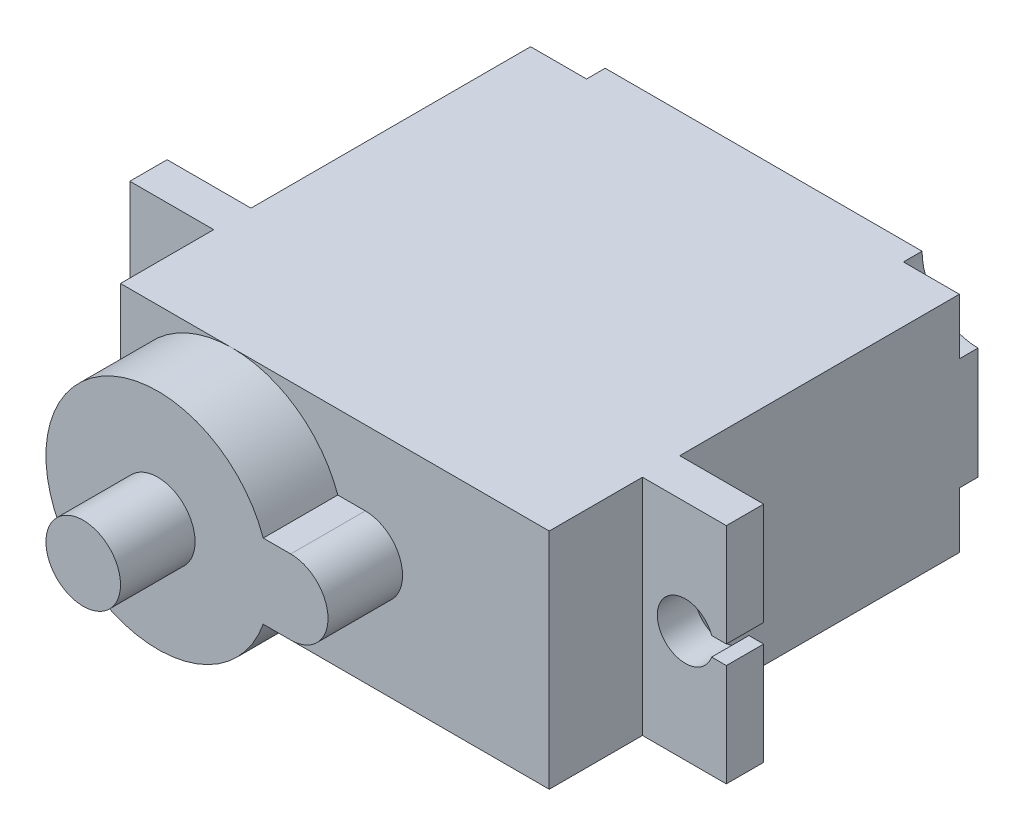
ISO-10303-21;
HEADER;
FILE_DESCRIPTION(('STEP AP214'),'2;1');
FILE_NAME('part.step','',(''),(''),'','','');
FILE_SCHEMA(('AUTOMOTIVE_DESIGN { 1 0 10303 214 1 1 1 1 }'));
ENDSEC;
DATA;
#1=APPLICATION_CONTEXT('core data for automotive mechanical design processes');
#2=APPLICATION_PROTOCOL_DEFINITION('international standard','automotive_design',2000,#1);
#3=PRODUCT_CONTEXT('',#1,'mechanical');
#4=PRODUCT('Part','Part','',(#3));
#5=PRODUCT_RELATED_PRODUCT_CATEGORY('part','',(#4));
#6=PRODUCT_DEFINITION_FORMATION('','',#4);
#7=PRODUCT_DEFINITION_CONTEXT('part definition',#1,'design');
#8=PRODUCT_DEFINITION('design','',#6,#7);
#9=PRODUCT_DEFINITION_SHAPE('','',#8);
#10=(LENGTH_UNIT() NAMED_UNIT(*) SI_UNIT(.MILLI.,.METRE.));
#11=(NAMED_UNIT(*) PLANE_ANGLE_UNIT() SI_UNIT($,.RADIAN.));
#12=(NAMED_UNIT(*) SI_UNIT($,.STERADIAN.) SOLID_ANGLE_UNIT());
#13=UNCERTAINTY_MEASURE_WITH_UNIT(LENGTH_MEASURE(1.E-05),#10,'distance_accuracy_value','');
#14=(GEOMETRIC_REPRESENTATION_CONTEXT(3) GLOBAL_UNCERTAINTY_ASSIGNED_CONTEXT((#13)) GLOBAL_UNIT_ASSIGNED_CONTEXT((#10,
#11,#12)) REPRESENTATION_CONTEXT('',''));
#15=CARTESIAN_POINT('',(0.,0.,0.));
#16=DIRECTION('',(0.,0.,1.));
#17=DIRECTION('',(1.,0.,0.));
#18=AXIS2_PLACEMENT_3D('',#15,#16,#17);
#19=CARTESIAN_POINT('',(-11.5,6.,16.));
#20=DIRECTION('',(1.,0.,0.));
#21=DIRECTION('',(0.,0.,-1.));
#22=AXIS2_PLACEMENT_3D('',#19,#20,#21);
#23=PLANE('',#22);
#24=DIRECTION('',(0.,0.,-1.));
#25=VECTOR('',#24,1.);
#26=CARTESIAN_POINT('',(-11.5,-3.,1.));
#27=LINE('',#26,#25);
#28=CARTESIAN_POINT('',(-11.5,-3.,1.));
#29=VERTEX_POINT('',#28);
#30=CARTESIAN_POINT('',(-11.5,-3.,0.));
#31=VERTEX_POINT('',#30);
#32=EDGE_CURVE('E50',#29,#31,#27,.T.);
#33=ORIENTED_EDGE('',*,*,#32,.F.);
#34=DIRECTION('',(0.,1.,0.));
#35=VECTOR('',#34,1.);
#36=CARTESIAN_POINT('',(-11.5,6.,1.));
#37=LINE('',#36,#35);
#38=CARTESIAN_POINT('',(-11.5,-6.,1.));
#39=VERTEX_POINT('',#38);
#40=EDGE_CURVE('E262',#39,#29,#37,.T.);
#41=ORIENTED_EDGE('',*,*,#40,.F.);
#42=DIRECTION('',(0.,0.,-1.));
#43=VECTOR('',#42,1.);
#44=CARTESIAN_POINT('',(-11.5,-6.,16.));
#45=LINE('',#44,#43);
#46=CARTESIAN_POINT('',(-11.5,-6.,16.));
#47=VERTEX_POINT('',#46);
#48=EDGE_CURVE('E267',#47,#39,#45,.T.);
#49=ORIENTED_EDGE('',*,*,#48,.F.);
#50=DIRECTION('',(0.,-1.,0.));
#51=VECTOR('',#50,1.);
#52=CARTESIAN_POINT('',(-11.5,6.,16.));
#53=LINE('',#52,#51);
#54=CARTESIAN_POINT('',(-11.5,6.,16.));
#55=VERTEX_POINT('',#54);
#56=EDGE_CURVE('E281',#55,#47,#53,.T.);
#57=ORIENTED_EDGE('',*,*,#56,.F.);
#58=DIRECTION('',(0.,0.,-1.));
#59=VECTOR('',#58,1.);
#60=CARTESIAN_POINT('',(-11.5,6.,16.));
#61=LINE('',#60,#59);
#62=CARTESIAN_POINT('',(-11.5,6.,1.));
#63=VERTEX_POINT('',#62);
#64=EDGE_CURVE('E274',#55,#63,#61,.T.);
#65=ORIENTED_EDGE('',*,*,#64,.T.);
#66=DIRECTION('',(0.,1.,0.));
#67=VECTOR('',#66,1.);
#68=CARTESIAN_POINT('',(-11.5,6.,1.));
#69=LINE('',#68,#67);
#70=CARTESIAN_POINT('',(-11.5,3.,1.));
#71=VERTEX_POINT('',#70);
#72=EDGE_CURVE('E534',#71,#63,#69,.T.);
#73=ORIENTED_EDGE('',*,*,#72,.F.);
#74=DIRECTION('',(0.,0.,-1.));
#75=VECTOR('',#74,1.);
#76=CARTESIAN_POINT('',(-11.5,3.,1.));
#77=LINE('',#76,#75);
#78=CARTESIAN_POINT('',(-11.5,3.,0.));
#79=VERTEX_POINT('',#78);
#80=EDGE_CURVE('E575',#71,#79,#77,.T.);
#81=ORIENTED_EDGE('',*,*,#80,.T.);
#82=DIRECTION('',(0.,-1.,0.));
#83=VECTOR('',#82,1.);
#84=CARTESIAN_POINT('',(-11.5,6.,0.));
#85=LINE('',#84,#83);
#86=EDGE_CURVE('E300',#79,#31,#85,.T.);
#87=ORIENTED_EDGE('',*,*,#86,.T.);
#88=EDGE_LOOP('',(#33,#41,#49,#57,#65,#73,#81,#87));
#89=FACE_BOUND('',#88,.T.);
#90=ADVANCED_FACE('F35',(#89),#23,.F.);
#91=CARTESIAN_POINT('',(-11.5,-6.,16.));
#92=DIRECTION('',(0.,1.,0.));
#93=DIRECTION('',(0.,0.,1.));
#94=AXIS2_PLACEMENT_3D('',#91,#92,#93);
#95=PLANE('',#94);
#96=DIRECTION('',(0.,0.,-1.));
#97=VECTOR('',#96,1.);
#98=CARTESIAN_POINT('',(-8.5,-6.,1.));
#99=LINE('',#98,#97);
#100=CARTESIAN_POINT('',(-8.5,-6.,0.));
#101=VERTEX_POINT('',#100);
#102=CARTESIAN_POINT('',(-8.5,-6.,1.));
#103=VERTEX_POINT('',#102);
#104=EDGE_CURVE('E252',#101,#103,#99,.F.);
#105=ORIENTED_EDGE('',*,*,#104,.F.);
#106=DIRECTION('',(1.,0.,0.));
#107=VECTOR('',#106,1.);
#108=CARTESIAN_POINT('',(-11.5,-6.,0.));
#109=LINE('',#108,#107);
#110=CARTESIAN_POINT('',(8.5,-6.,0.));
#111=VERTEX_POINT('',#110);
#112=EDGE_CURVE('E58',#101,#111,#109,.T.);
#113=ORIENTED_EDGE('',*,*,#112,.T.);
#114=DIRECTION('',(0.,0.,-1.));
#115=VECTOR('',#114,1.);
#116=CARTESIAN_POINT('',(8.5,-6.,1.));
#117=LINE('',#116,#115);
#118=CARTESIAN_POINT('',(8.5,-6.,1.));
#119=VERTEX_POINT('',#118);
#120=EDGE_CURVE('E547',#111,#119,#117,.F.);
#121=ORIENTED_EDGE('',*,*,#120,.T.);
#122=DIRECTION('',(-1.,0.,0.));
#123=VECTOR('',#122,1.);
#124=CARTESIAN_POINT('',(-11.5,-6.,1.));
#125=LINE('',#124,#123);
#126=CARTESIAN_POINT('',(11.5,-6.,1.));
#127=VERTEX_POINT('',#126);
#128=EDGE_CURVE('E43',#127,#119,#125,.T.);
#129=ORIENTED_EDGE('',*,*,#128,.F.);
#130=DIRECTION('',(0.,0.,-1.));
#131=VECTOR('',#130,1.);
#132=CARTESIAN_POINT('',(11.5,-6.,16.));
#133=LINE('',#132,#131);
#134=CARTESIAN_POINT('',(11.5,-6.,16.));
#135=VERTEX_POINT('',#134);
#136=EDGE_CURVE('E275',#135,#127,#133,.T.);
#137=ORIENTED_EDGE('',*,*,#136,.F.);
#138=DIRECTION('',(1.,0.,0.));
#139=VECTOR('',#138,1.);
#140=CARTESIAN_POINT('',(-16.,-6.,16.));
#141=LINE('',#140,#139);
#142=CARTESIAN_POINT('',(16.,-6.,16.));
#143=VERTEX_POINT('',#142);
#144=EDGE_CURVE('E411',#135,#143,#141,.T.);
#145=ORIENTED_EDGE('',*,*,#144,.T.);
#146=DIRECTION('',(0.,0.,-1.));
#147=VECTOR('',#146,1.);
#148=CARTESIAN_POINT('',(16.,-6.,18.));
#149=LINE('',#148,#147);
#150=CARTESIAN_POINT('',(16.,-6.,18.));
#151=VERTEX_POINT('',#150);
#152=EDGE_CURVE('E391',#151,#143,#149,.T.);
#153=ORIENTED_EDGE('',*,*,#152,.F.);
#154=DIRECTION('',(1.,0.,0.));
#155=VECTOR('',#154,1.);
#156=CARTESIAN_POINT('',(-16.,-6.,18.));
#157=LINE('',#156,#155);
#158=CARTESIAN_POINT('',(11.5,-6.,18.));
#159=VERTEX_POINT('',#158);
#160=EDGE_CURVE('E324',#159,#151,#157,.T.);
#161=ORIENTED_EDGE('',*,*,#160,.F.);
#162=DIRECTION('',(0.,0.,-1.));
#163=VECTOR('',#162,1.);
#164=CARTESIAN_POINT('',(11.5,-6.,23.));
#165=LINE('',#164,#163);
#166=CARTESIAN_POINT('',(11.5,-6.,23.));
#167=VERTEX_POINT('',#166);
#168=EDGE_CURVE('E510',#167,#159,#165,.T.);
#169=ORIENTED_EDGE('',*,*,#168,.F.);
#170=DIRECTION('',(1.,0.,0.));
#171=VECTOR('',#170,1.);
#172=CARTESIAN_POINT('',(-11.5,-6.,23.));
#173=LINE('',#172,#171);
#174=CARTESIAN_POINT('',(-5.5,-6.,23.));
#175=VERTEX_POINT('',#174);
#176=EDGE_CURVE('E497',#175,#167,#173,.T.);
#177=ORIENTED_EDGE('',*,*,#176,.F.);
#178=CARTESIAN_POINT('',(-11.5,-6.,23.));
#179=VERTEX_POINT('',#178);
#180=EDGE_CURVE('E498',#179,#175,#173,.T.);
#181=ORIENTED_EDGE('',*,*,#180,.F.);
#182=DIRECTION('',(0.,0.,-1.));
#183=VECTOR('',#182,1.);
#184=CARTESIAN_POINT('',(-11.5,-6.,23.));
#185=LINE('',#184,#183);
#186=CARTESIAN_POINT('',(-11.5,-6.,18.));
#187=VERTEX_POINT('',#186);
#188=EDGE_CURVE('E508',#179,#187,#185,.T.);
#189=ORIENTED_EDGE('',*,*,#188,.T.);
#190=CARTESIAN_POINT('',(-16.,-6.,18.));
#191=VERTEX_POINT('',#190);
#192=EDGE_CURVE('E320',#191,#187,#157,.T.);
#193=ORIENTED_EDGE('',*,*,#192,.F.);
#194=DIRECTION('',(0.,0.,-1.));
#195=VECTOR('',#194,1.);
#196=CARTESIAN_POINT('',(-16.,-6.,18.));
#197=LINE('',#196,#195);
#198=CARTESIAN_POINT('',(-16.,-6.,16.));
#199=VERTEX_POINT('',#198);
#200=EDGE_CURVE('E299',#191,#199,#197,.T.);
#201=ORIENTED_EDGE('',*,*,#200,.T.);
#202=EDGE_CURVE('E270',#199,#47,#141,.T.);
#203=ORIENTED_EDGE('',*,*,#202,.T.);
#204=ORIENTED_EDGE('',*,*,#48,.T.);
#205=DIRECTION('',(-1.,0.,0.));
#206=VECTOR('',#205,1.);
#207=CARTESIAN_POINT('',(-11.5,-6.,1.));
#208=LINE('',#207,#206);
#209=EDGE_CURVE('E11',#103,#39,#208,.T.);
#210=ORIENTED_EDGE('',*,*,#209,.F.);
#211=EDGE_LOOP('',(#105,#113,#121,#129,#137,#145,#153,#161,#169,#177,#181,#189,#193,#201,#203,
#204,#210));
#212=FACE_BOUND('',#211,.T.);
#213=ADVANCED_FACE('F265',(#212),#95,.F.);
#214=CARTESIAN_POINT('',(11.5,6.,16.));
#215=DIRECTION('',(-1.,0.,0.));
#216=DIRECTION('',(0.,0.,1.));
#217=AXIS2_PLACEMENT_3D('',#214,#215,#216);
#218=PLANE('',#217);
#219=DIRECTION('',(0.,-1.,0.));
#220=VECTOR('',#219,1.);
#221=CARTESIAN_POINT('',(11.5,6.,1.));
#222=LINE('',#221,#220);
#223=CARTESIAN_POINT('',(11.5,-3.,1.));
#224=VERTEX_POINT('',#223);
#225=EDGE_CURVE('E544',#224,#127,#222,.T.);
#226=ORIENTED_EDGE('',*,*,#225,.F.);
#227=DIRECTION('',(0.,0.,-1.));
#228=VECTOR('',#227,1.);
#229=CARTESIAN_POINT('',(11.5,-3.,1.));
#230=LINE('',#229,#228);
#231=CARTESIAN_POINT('',(11.5,-3.,0.));
#232=VERTEX_POINT('',#231);
#233=EDGE_CURVE('E550',#224,#232,#230,.T.);
#234=ORIENTED_EDGE('',*,*,#233,.T.);
#235=DIRECTION('',(0.,1.,0.));
#236=VECTOR('',#235,1.);
#237=CARTESIAN_POINT('',(11.5,6.,0.));
#238=LINE('',#237,#236);
#239=CARTESIAN_POINT('',(11.5,3.,0.));
#240=VERTEX_POINT('',#239);
#241=EDGE_CURVE('E296',#232,#240,#238,.T.);
#242=ORIENTED_EDGE('',*,*,#241,.T.);
#243=DIRECTION('',(0.,0.,-1.));
#244=VECTOR('',#243,1.);
#245=CARTESIAN_POINT('',(11.5,3.,1.));
#246=LINE('',#245,#244);
#247=CARTESIAN_POINT('',(11.5,3.,1.));
#248=VERTEX_POINT('',#247);
#249=EDGE_CURVE('E566',#248,#240,#246,.T.);
#250=ORIENTED_EDGE('',*,*,#249,.F.);
#251=DIRECTION('',(0.,-1.,0.));
#252=VECTOR('',#251,1.);
#253=CARTESIAN_POINT('',(11.5,6.,1.));
#254=LINE('',#253,#252);
#255=CARTESIAN_POINT('',(11.5,6.,1.));
#256=VERTEX_POINT('',#255);
#257=EDGE_CURVE('E569',#256,#248,#254,.T.);
#258=ORIENTED_EDGE('',*,*,#257,.F.);
#259=DIRECTION('',(0.,0.,-1.));
#260=VECTOR('',#259,1.);
#261=CARTESIAN_POINT('',(11.5,6.,16.));
#262=LINE('',#261,#260);
#263=CARTESIAN_POINT('',(11.5,6.,16.));
#264=VERTEX_POINT('',#263);
#265=EDGE_CURVE('E278',#264,#256,#262,.T.);
#266=ORIENTED_EDGE('',*,*,#265,.F.);
#267=DIRECTION('',(0.,1.,0.));
#268=VECTOR('',#267,1.);
#269=CARTESIAN_POINT('',(11.5,6.,16.));
#270=LINE('',#269,#268);
#271=EDGE_CURVE('E289',#135,#264,#270,.T.);
#272=ORIENTED_EDGE('',*,*,#271,.F.);
#273=ORIENTED_EDGE('',*,*,#136,.T.);
#274=EDGE_LOOP('',(#226,#234,#242,#250,#258,#266,#272,#273));
#275=FACE_BOUND('',#274,.T.);
#276=ADVANCED_FACE('F37',(#275),#218,.F.);
#277=CARTESIAN_POINT('',(-11.5,6.,16.));
#278=DIRECTION('',(0.,-1.,0.));
#279=DIRECTION('',(0.,0.,-1.));
#280=AXIS2_PLACEMENT_3D('',#277,#278,#279);
#281=PLANE('',#280);
#282=DIRECTION('',(0.,0.,-1.));
#283=VECTOR('',#282,1.);
#284=CARTESIAN_POINT('',(8.5,6.,1.));
#285=LINE('',#284,#283);
#286=CARTESIAN_POINT('',(8.5,6.,0.));
#287=VERTEX_POINT('',#286);
#288=CARTESIAN_POINT('',(8.5,6.,1.));
#289=VERTEX_POINT('',#288);
#290=EDGE_CURVE('E562',#287,#289,#285,.F.);
#291=ORIENTED_EDGE('',*,*,#290,.F.);
#292=DIRECTION('',(-1.,0.,0.));
#293=VECTOR('',#292,1.);
#294=CARTESIAN_POINT('',(-11.5,6.,0.));
#295=LINE('',#294,#293);
#296=CARTESIAN_POINT('',(-8.5,6.,0.));
#297=VERTEX_POINT('',#296);
#298=EDGE_CURVE('E298',#287,#297,#295,.T.);
#299=ORIENTED_EDGE('',*,*,#298,.T.);
#300=DIRECTION('',(0.,0.,-1.));
#301=VECTOR('',#300,1.);
#302=CARTESIAN_POINT('',(-8.5,6.,1.));
#303=LINE('',#302,#301);
#304=CARTESIAN_POINT('',(-8.5,6.,1.));
#305=VERTEX_POINT('',#304);
#306=EDGE_CURVE('E578',#297,#305,#303,.F.);
#307=ORIENTED_EDGE('',*,*,#306,.T.);
#308=DIRECTION('',(1.,0.,0.));
#309=VECTOR('',#308,1.);
#310=CARTESIAN_POINT('',(-11.5,6.,1.));
#311=LINE('',#310,#309);
#312=EDGE_CURVE('E581',#63,#305,#311,.T.);
#313=ORIENTED_EDGE('',*,*,#312,.F.);
#314=ORIENTED_EDGE('',*,*,#64,.F.);
#315=DIRECTION('',(-1.,0.,0.));
#316=VECTOR('',#315,1.);
#317=CARTESIAN_POINT('',(-16.,6.,16.));
#318=LINE('',#317,#316);
#319=CARTESIAN_POINT('',(-16.,6.,16.));
#320=VERTEX_POINT('',#319);
#321=EDGE_CURVE('E367',#55,#320,#318,.T.);
#322=ORIENTED_EDGE('',*,*,#321,.T.);
#323=DIRECTION('',(0.,0.,-1.));
#324=VECTOR('',#323,1.);
#325=CARTESIAN_POINT('',(-16.,6.,18.));
#326=LINE('',#325,#324);
#327=CARTESIAN_POINT('',(-16.,6.,18.));
#328=VERTEX_POINT('',#327);
#329=EDGE_CURVE('E344',#328,#320,#326,.T.);
#330=ORIENTED_EDGE('',*,*,#329,.F.);
#331=DIRECTION('',(-1.,0.,0.));
#332=VECTOR('',#331,1.);
#333=CARTESIAN_POINT('',(-16.,6.,18.));
#334=LINE('',#333,#332);
#335=CARTESIAN_POINT('',(-11.5,6.,18.));
#336=VERTEX_POINT('',#335);
#337=EDGE_CURVE('E335',#336,#328,#334,.T.);
#338=ORIENTED_EDGE('',*,*,#337,.F.);
#339=DIRECTION('',(0.,0.,-1.));
#340=VECTOR('',#339,1.);
#341=CARTESIAN_POINT('',(-11.5,6.,23.));
#342=LINE('',#341,#340);
#343=CARTESIAN_POINT('',(-11.5,6.,23.));
#344=VERTEX_POINT('',#343);
#345=EDGE_CURVE('E408',#344,#336,#342,.T.);
#346=ORIENTED_EDGE('',*,*,#345,.F.);
#347=DIRECTION('',(-1.,0.,0.));
#348=VECTOR('',#347,1.);
#349=CARTESIAN_POINT('',(11.5,6.,23.));
#350=LINE('',#349,#348);
#351=CARTESIAN_POINT('',(-5.5,6.,23.));
#352=VERTEX_POINT('',#351);
#353=EDGE_CURVE('E493',#352,#344,#350,.T.);
#354=ORIENTED_EDGE('',*,*,#353,.F.);
#355=CARTESIAN_POINT('',(11.5,6.,23.));
#356=VERTEX_POINT('',#355);
#357=EDGE_CURVE('E489',#356,#352,#350,.T.);
#358=ORIENTED_EDGE('',*,*,#357,.F.);
#359=DIRECTION('',(0.,0.,-1.));
#360=VECTOR('',#359,1.);
#361=CARTESIAN_POINT('',(11.5,6.,23.));
#362=LINE('',#361,#360);
#363=CARTESIAN_POINT('',(11.5,6.,18.));
#364=VERTEX_POINT('',#363);
#365=EDGE_CURVE('E503',#356,#364,#362,.T.);
#366=ORIENTED_EDGE('',*,*,#365,.T.);
#367=CARTESIAN_POINT('',(16.,6.,18.));
#368=VERTEX_POINT('',#367);
#369=EDGE_CURVE('E343',#368,#364,#334,.T.);
#370=ORIENTED_EDGE('',*,*,#369,.F.);
#371=DIRECTION('',(0.,0.,-1.));
#372=VECTOR('',#371,1.);
#373=CARTESIAN_POINT('',(16.,6.,18.));
#374=LINE('',#373,#372);
#375=CARTESIAN_POINT('',(16.,6.,16.));
#376=VERTEX_POINT('',#375);
#377=EDGE_CURVE('E349',#368,#376,#374,.T.);
#378=ORIENTED_EDGE('',*,*,#377,.T.);
#379=EDGE_CURVE('E375',#376,#264,#318,.T.);
#380=ORIENTED_EDGE('',*,*,#379,.T.);
#381=ORIENTED_EDGE('',*,*,#265,.T.);
#382=DIRECTION('',(1.,0.,0.));
#383=VECTOR('',#382,1.);
#384=CARTESIAN_POINT('',(-11.5,6.,1.));
#385=LINE('',#384,#383);
#386=EDGE_CURVE('E536',#289,#256,#385,.T.);
#387=ORIENTED_EDGE('',*,*,#386,.F.);
#388=EDGE_LOOP('',(#291,#299,#307,#313,#314,#322,#330,#338,#346,#354,#358,#366,#370,#378,#380,
#381,#387));
#389=FACE_BOUND('',#388,.T.);
#390=ADVANCED_FACE('F365',(#389),#281,.F.);
#391=CARTESIAN_POINT('',(0.,0.,16.));
#392=DIRECTION('',(0.,0.,1.));
#393=DIRECTION('',(1.,0.,0.));
#394=AXIS2_PLACEMENT_3D('',#391,#392,#393);
#395=PLANE('',#394);
#396=DIRECTION('',(-1.,0.,0.));
#397=VECTOR('',#396,1.);
#398=CARTESIAN_POINT('',(0.,-0.499999999999998,16.));
#399=LINE('',#398,#397);
#400=CARTESIAN_POINT('',(-15.2118516965135,-0.5,16.));
#401=VERTEX_POINT('',#400);
#402=CARTESIAN_POINT('',(-16.,-0.5,16.));
#403=VERTEX_POINT('',#402);
#404=EDGE_CURVE('E421',#401,#403,#399,.T.);
#405=ORIENTED_EDGE('',*,*,#404,.F.);
#406=CARTESIAN_POINT('',(-13.7976381341404,0.,16.));
#407=DIRECTION('',(0.,0.,1.));
#408=DIRECTION('',(1.,0.,0.));
#409=AXIS2_PLACEMENT_3D('',#406,#407,#408);
#410=CIRCLE('',#409,1.5);
#411=CARTESIAN_POINT('',(-15.2118516965135,0.5,16.));
#412=VERTEX_POINT('',#411);
#413=EDGE_CURVE('E417',#412,#401,#410,.F.);
#414=ORIENTED_EDGE('',*,*,#413,.F.);
#415=DIRECTION('',(1.,0.,0.));
#416=VECTOR('',#415,1.);
#417=CARTESIAN_POINT('',(0.,0.5,16.));
#418=LINE('',#417,#416);
#419=CARTESIAN_POINT('',(-16.,0.5,16.));
#420=VERTEX_POINT('',#419);
#421=EDGE_CURVE('E416',#420,#412,#418,.T.);
#422=ORIENTED_EDGE('',*,*,#421,.F.);
#423=DIRECTION('',(0.,-1.,0.));
#424=VECTOR('',#423,1.);
#425=CARTESIAN_POINT('',(-16.,6.,16.));
#426=LINE('',#425,#424);
#427=EDGE_CURVE('E338',#320,#420,#426,.T.);
#428=ORIENTED_EDGE('',*,*,#427,.F.);
#429=ORIENTED_EDGE('',*,*,#321,.F.);
#430=ORIENTED_EDGE('',*,*,#56,.T.);
#431=ORIENTED_EDGE('',*,*,#202,.F.);
#432=EDGE_CURVE('E404',#403,#199,#426,.T.);
#433=ORIENTED_EDGE('',*,*,#432,.F.);
#434=EDGE_LOOP('',(#405,#414,#422,#428,#429,#430,#431,#433));
#435=FACE_BOUND('',#434,.T.);
#436=ADVANCED_FACE('F409',(#435),#395,.F.);
#437=CARTESIAN_POINT('',(-16.,6.,18.));
#438=DIRECTION('',(1.,0.,0.));
#439=DIRECTION('',(0.,0.,-1.));
#440=AXIS2_PLACEMENT_3D('',#437,#438,#439);
#441=PLANE('',#440);
#442=DIRECTION('',(0.,0.,1.));
#443=VECTOR('',#442,1.);
#444=CARTESIAN_POINT('',(-16.,-0.5,14.));
#445=LINE('',#444,#443);
#446=CARTESIAN_POINT('',(-16.,-0.5,18.));
#447=VERTEX_POINT('',#446);
#448=EDGE_CURVE('E405',#403,#447,#445,.T.);
#449=ORIENTED_EDGE('',*,*,#448,.F.);
#450=ORIENTED_EDGE('',*,*,#432,.T.);
#451=ORIENTED_EDGE('',*,*,#200,.F.);
#452=DIRECTION('',(0.,-1.,0.));
#453=VECTOR('',#452,1.);
#454=CARTESIAN_POINT('',(-16.,6.,18.));
#455=LINE('',#454,#453);
#456=EDGE_CURVE('E374',#447,#191,#455,.T.);
#457=ORIENTED_EDGE('',*,*,#456,.F.);
#458=EDGE_LOOP('',(#449,#450,#451,#457));
#459=FACE_BOUND('',#458,.T.);
#460=ADVANCED_FACE('F402',(#459),#441,.F.);
#461=DIRECTION('',(0.,0.,1.));
#462=VECTOR('',#461,1.);
#463=CARTESIAN_POINT('',(-16.,0.5,14.));
#464=LINE('',#463,#462);
#465=CARTESIAN_POINT('',(-16.,0.5,18.));
#466=VERTEX_POINT('',#465);
#467=EDGE_CURVE('E373',#420,#466,#464,.T.);
#468=ORIENTED_EDGE('',*,*,#467,.T.);
#469=EDGE_CURVE('E329',#328,#466,#455,.T.);
#470=ORIENTED_EDGE('',*,*,#469,.F.);
#471=ORIENTED_EDGE('',*,*,#329,.T.);
#472=ORIENTED_EDGE('',*,*,#427,.T.);
#473=EDGE_LOOP('',(#468,#470,#471,#472));
#474=FACE_BOUND('',#473,.T.);
#475=ADVANCED_FACE('F372',(#474),#441,.F.);
#476=CARTESIAN_POINT('',(0.,0.,18.));
#477=DIRECTION('',(0.,0.,1.));
#478=DIRECTION('',(1.,0.,0.));
#479=AXIS2_PLACEMENT_3D('',#476,#477,#478);
#480=PLANE('',#479);
#481=CARTESIAN_POINT('',(-13.7976381341404,0.,18.));
#482=DIRECTION('',(0.,0.,-1.));
#483=DIRECTION('',(-1.,0.,0.));
#484=AXIS2_PLACEMENT_3D('',#481,#482,#483);
#485=CIRCLE('',#484,1.5);
#486=CARTESIAN_POINT('',(-15.2118516965135,0.5,18.));
#487=VERTEX_POINT('',#486);
#488=CARTESIAN_POINT('',(-15.2118516965135,-0.5,18.));
#489=VERTEX_POINT('',#488);
#490=EDGE_CURVE('E583',#487,#489,#485,.T.);
#491=ORIENTED_EDGE('',*,*,#490,.T.);
#492=DIRECTION('',(-1.,0.,0.));
#493=VECTOR('',#492,1.);
#494=CARTESIAN_POINT('',(-16.,-0.5,18.));
#495=LINE('',#494,#493);
#496=EDGE_CURVE('E587',#489,#447,#495,.T.);
#497=ORIENTED_EDGE('',*,*,#496,.T.);
#498=ORIENTED_EDGE('',*,*,#456,.T.);
#499=ORIENTED_EDGE('',*,*,#192,.T.);
#500=DIRECTION('',(0.,-1.,0.));
#501=VECTOR('',#500,1.);
#502=CARTESIAN_POINT('',(-11.5,6.,18.));
#503=LINE('',#502,#501);
#504=EDGE_CURVE('E360',#336,#187,#503,.T.);
#505=ORIENTED_EDGE('',*,*,#504,.F.);
#506=ORIENTED_EDGE('',*,*,#337,.T.);
#507=ORIENTED_EDGE('',*,*,#469,.T.);
#508=DIRECTION('',(1.,0.,0.));
#509=VECTOR('',#508,1.);
#510=CARTESIAN_POINT('',(-15.2118516965135,0.5,18.));
#511=LINE('',#510,#509);
#512=EDGE_CURVE('E585',#466,#487,#511,.T.);
#513=ORIENTED_EDGE('',*,*,#512,.T.);
#514=EDGE_LOOP('',(#491,#497,#498,#499,#505,#506,#507,#513));
#515=FACE_BOUND('',#514,.T.);
#516=ADVANCED_FACE('F356',(#515),#480,.T.);
#517=CARTESIAN_POINT('',(16.,6.,18.));
#518=DIRECTION('',(-1.,0.,0.));
#519=DIRECTION('',(0.,-1.,0.));
#520=AXIS2_PLACEMENT_3D('',#517,#518,#519);
#521=PLANE('',#520);
#522=DIRECTION('',(0.,1.,0.));
#523=VECTOR('',#522,1.);
#524=CARTESIAN_POINT('',(16.,6.,18.));
#525=LINE('',#524,#523);
#526=CARTESIAN_POINT('',(16.,0.5,18.));
#527=VERTEX_POINT('',#526);
#528=EDGE_CURVE('E323',#527,#368,#525,.T.);
#529=ORIENTED_EDGE('',*,*,#528,.F.);
#530=DIRECTION('',(0.,0.,-1.));
#531=VECTOR('',#530,1.);
#532=CARTESIAN_POINT('',(16.,0.5,18.));
#533=LINE('',#532,#531);
#534=CARTESIAN_POINT('',(16.,0.5,16.));
#535=VERTEX_POINT('',#534);
#536=EDGE_CURVE('E528',#527,#535,#533,.T.);
#537=ORIENTED_EDGE('',*,*,#536,.T.);
#538=DIRECTION('',(0.,1.,0.));
#539=VECTOR('',#538,1.);
#540=CARTESIAN_POINT('',(16.,6.,16.));
#541=LINE('',#540,#539);
#542=EDGE_CURVE('E410',#535,#376,#541,.T.);
#543=ORIENTED_EDGE('',*,*,#542,.T.);
#544=ORIENTED_EDGE('',*,*,#377,.F.);
#545=EDGE_LOOP('',(#529,#537,#543,#544));
#546=FACE_BOUND('',#545,.T.);
#547=ADVANCED_FACE('F669',(#546),#521,.F.);
#548=CARTESIAN_POINT('',(0.,0.,23.));
#549=DIRECTION('',(0.,0.,1.));
#550=DIRECTION('',(1.,0.,0.));
#551=AXIS2_PLACEMENT_3D('',#548,#549,#550);
#552=PLANE('',#551);
#553=CARTESIAN_POINT('',(-5.5,0.,23.));
#554=DIRECTION('',(0.,0.,1.));
#555=DIRECTION('',(1.,0.,0.));
#556=AXIS2_PLACEMENT_3D('',#553,#554,#555);
#557=CIRCLE('',#556,6.);
#558=CARTESIAN_POINT('',(-11.5,0.,23.));
#559=VERTEX_POINT('',#558);
#560=EDGE_CURVE('E475',#559,#175,#557,.T.);
#561=ORIENTED_EDGE('',*,*,#560,.F.);
#562=DIRECTION('',(0.,-1.,0.));
#563=VECTOR('',#562,1.);
#564=CARTESIAN_POINT('',(-11.5,6.,23.));
#565=LINE('',#564,#563);
#566=EDGE_CURVE('E492',#559,#179,#565,.T.);
#567=ORIENTED_EDGE('',*,*,#566,.T.);
#568=ORIENTED_EDGE('',*,*,#180,.T.);
#569=EDGE_LOOP('',(#561,#567,#568));
#570=FACE_BOUND('',#569,.T.);
#571=ADVANCED_FACE('F648',(#570),#552,.T.);
#572=CARTESIAN_POINT('',(0.156854249492381,-2.,23.));
#573=VERTEX_POINT('',#572);
#574=EDGE_CURVE('E644',#175,#573,#557,.T.);
#575=ORIENTED_EDGE('',*,*,#574,.F.);
#576=ORIENTED_EDGE('',*,*,#176,.T.);
#577=DIRECTION('',(0.,1.,0.));
#578=VECTOR('',#577,1.);
#579=CARTESIAN_POINT('',(11.5,-6.,23.));
#580=LINE('',#579,#578);
#581=EDGE_CURVE('E501',#167,#356,#580,.T.);
#582=ORIENTED_EDGE('',*,*,#581,.T.);
#583=ORIENTED_EDGE('',*,*,#357,.T.);
#584=CARTESIAN_POINT('',(0.156854249492381,2.,23.));
#585=VERTEX_POINT('',#584);
#586=EDGE_CURVE('E472',#585,#352,#557,.T.);
#587=ORIENTED_EDGE('',*,*,#586,.F.);
#588=DIRECTION('',(-1.,0.,0.));
#589=VECTOR('',#588,1.);
#590=CARTESIAN_POINT('',(1.6312629321939,2.,23.));
#591=LINE('',#590,#589);
#592=CARTESIAN_POINT('',(1.6312629321939,2.,23.));
#593=VERTEX_POINT('',#592);
#594=EDGE_CURVE('E469',#593,#585,#591,.T.);
#595=ORIENTED_EDGE('',*,*,#594,.F.);
#596=CARTESIAN_POINT('',(1.6312629321939,0.,23.));
#597=DIRECTION('',(0.,0.,1.));
#598=DIRECTION('',(1.,0.,0.));
#599=AXIS2_PLACEMENT_3D('',#596,#597,#598);
#600=CIRCLE('',#599,2.);
#601=CARTESIAN_POINT('',(1.6312629321939,-2.,23.));
#602=VERTEX_POINT('',#601);
#603=EDGE_CURVE('E453',#602,#593,#600,.T.);
#604=ORIENTED_EDGE('',*,*,#603,.F.);
#605=DIRECTION('',(1.,0.,0.));
#606=VECTOR('',#605,1.);
#607=CARTESIAN_POINT('',(1.6312629321939,-2.,23.));
#608=LINE('',#607,#606);
#609=EDGE_CURVE('E460',#573,#602,#608,.T.);
#610=ORIENTED_EDGE('',*,*,#609,.F.);
#611=EDGE_LOOP('',(#575,#576,#582,#583,#587,#595,#604,#610));
#612=FACE_BOUND('',#611,.T.);
#613=ADVANCED_FACE('F642',(#612),#552,.T.);
#614=DIRECTION('',(-1.,0.,0.));
#615=VECTOR('',#614,1.);
#616=CARTESIAN_POINT('',(15.2118516965135,0.5,18.));
#617=LINE('',#616,#615);
#618=CARTESIAN_POINT('',(15.2118516965135,0.5,18.));
#619=VERTEX_POINT('',#618);
#620=EDGE_CURVE('E436',#527,#619,#617,.T.);
#621=ORIENTED_EDGE('',*,*,#620,.F.);
#622=ORIENTED_EDGE('',*,*,#528,.T.);
#623=ORIENTED_EDGE('',*,*,#369,.T.);
#624=DIRECTION('',(0.,1.,0.));
#625=VECTOR('',#624,1.);
#626=CARTESIAN_POINT('',(11.5,-6.,18.));
#627=LINE('',#626,#625);
#628=EDGE_CURVE('E507',#159,#364,#627,.T.);
#629=ORIENTED_EDGE('',*,*,#628,.F.);
#630=ORIENTED_EDGE('',*,*,#160,.T.);
#631=CARTESIAN_POINT('',(16.,-0.5,18.));
#632=VERTEX_POINT('',#631);
#633=EDGE_CURVE('E331',#151,#632,#525,.T.);
#634=ORIENTED_EDGE('',*,*,#633,.T.);
#635=DIRECTION('',(1.,0.,0.));
#636=VECTOR('',#635,1.);
#637=CARTESIAN_POINT('',(16.,-0.5,18.));
#638=LINE('',#637,#636);
#639=CARTESIAN_POINT('',(15.2118516965135,-0.5,18.));
#640=VERTEX_POINT('',#639);
#641=EDGE_CURVE('E434',#640,#632,#638,.T.);
#642=ORIENTED_EDGE('',*,*,#641,.F.);
#643=CARTESIAN_POINT('',(13.7976381341404,0.,18.));
#644=DIRECTION('',(0.,0.,1.));
#645=DIRECTION('',(1.,0.,0.));
#646=AXIS2_PLACEMENT_3D('',#643,#644,#645);
#647=CIRCLE('',#646,1.5);
#648=EDGE_CURVE('E431',#619,#640,#647,.T.);
#649=ORIENTED_EDGE('',*,*,#648,.F.);
#650=EDGE_LOOP('',(#621,#622,#623,#629,#630,#634,#642,#649));
#651=FACE_BOUND('',#650,.T.);
#652=ADVANCED_FACE('F631',(#651),#480,.T.);
#653=CARTESIAN_POINT('',(0.,0.,0.));
#654=DIRECTION('',(0.,0.,1.));
#655=DIRECTION('',(1.,0.,0.));
#656=AXIS2_PLACEMENT_3D('',#653,#654,#655);
#657=PLANE('',#656);
#658=CARTESIAN_POINT('',(-11.5,-6.,0.));
#659=DIRECTION('',(0.,0.,1.));
#660=DIRECTION('',(-1.,0.,0.));
#661=AXIS2_PLACEMENT_3D('',#658,#659,#660);
#662=CIRCLE('',#661,3.);
#663=EDGE_CURVE('E256',#101,#31,#662,.T.);
#664=ORIENTED_EDGE('',*,*,#663,.T.);
#665=ORIENTED_EDGE('',*,*,#86,.F.);
#666=CARTESIAN_POINT('',(-11.5,6.,0.));
#667=DIRECTION('',(0.,0.,-1.));
#668=DIRECTION('',(-1.,0.,0.));
#669=AXIS2_PLACEMENT_3D('',#666,#667,#668);
#670=CIRCLE('',#669,3.);
#671=EDGE_CURVE('E571',#297,#79,#670,.T.);
#672=ORIENTED_EDGE('',*,*,#671,.F.);
#673=ORIENTED_EDGE('',*,*,#298,.F.);
#674=CARTESIAN_POINT('',(11.5,6.,0.));
#675=DIRECTION('',(0.,0.,1.));
#676=DIRECTION('',(1.,0.,0.));
#677=AXIS2_PLACEMENT_3D('',#674,#675,#676);
#678=CIRCLE('',#677,3.);
#679=EDGE_CURVE('E558',#287,#240,#678,.T.);
#680=ORIENTED_EDGE('',*,*,#679,.T.);
#681=ORIENTED_EDGE('',*,*,#241,.F.);
#682=CARTESIAN_POINT('',(11.5,-6.,0.));
#683=DIRECTION('',(0.,0.,-1.));
#684=DIRECTION('',(1.,0.,0.));
#685=AXIS2_PLACEMENT_3D('',#682,#683,#684);
#686=CIRCLE('',#685,3.);
#687=EDGE_CURVE('E551',#111,#232,#686,.T.);
#688=ORIENTED_EDGE('',*,*,#687,.F.);
#689=ORIENTED_EDGE('',*,*,#112,.F.);
#690=EDGE_LOOP('',(#664,#665,#672,#673,#680,#681,#688,#689));
#691=FACE_BOUND('',#690,.T.);
#692=ADVANCED_FACE('F674',(#691),#657,.F.);
#693=ORIENTED_EDGE('',*,*,#542,.F.);
#694=DIRECTION('',(-1.,0.,0.));
#695=VECTOR('',#694,1.);
#696=CARTESIAN_POINT('',(0.,0.5,16.));
#697=LINE('',#696,#695);
#698=CARTESIAN_POINT('',(15.2118516965135,0.5,16.));
#699=VERTEX_POINT('',#698);
#700=EDGE_CURVE('E446',#535,#699,#697,.T.);
#701=ORIENTED_EDGE('',*,*,#700,.T.);
#702=CARTESIAN_POINT('',(13.7976381341404,0.,16.));
#703=DIRECTION('',(0.,0.,1.));
#704=DIRECTION('',(1.,0.,0.));
#705=AXIS2_PLACEMENT_3D('',#702,#703,#704);
#706=CIRCLE('',#705,1.5);
#707=CARTESIAN_POINT('',(15.2118516965135,-0.5,16.));
#708=VERTEX_POINT('',#707);
#709=EDGE_CURVE('E531',#699,#708,#706,.T.);
#710=ORIENTED_EDGE('',*,*,#709,.T.);
#711=DIRECTION('',(1.,0.,0.));
#712=VECTOR('',#711,1.);
#713=CARTESIAN_POINT('',(0.,-0.499999999999998,16.));
#714=LINE('',#713,#712);
#715=CARTESIAN_POINT('',(16.,-0.5,16.));
#716=VERTEX_POINT('',#715);
#717=EDGE_CURVE('E442',#708,#716,#714,.T.);
#718=ORIENTED_EDGE('',*,*,#717,.T.);
#719=EDGE_CURVE('E381',#143,#716,#541,.T.);
#720=ORIENTED_EDGE('',*,*,#719,.F.);
#721=ORIENTED_EDGE('',*,*,#144,.F.);
#722=ORIENTED_EDGE('',*,*,#271,.T.);
#723=ORIENTED_EDGE('',*,*,#379,.F.);
#724=EDGE_LOOP('',(#693,#701,#710,#718,#720,#721,#722,#723));
#725=FACE_BOUND('',#724,.T.);
#726=ADVANCED_FACE('F620',(#725),#395,.F.);
#727=ORIENTED_EDGE('',*,*,#719,.T.);
#728=DIRECTION('',(0.,0.,1.));
#729=VECTOR('',#728,1.);
#730=CARTESIAN_POINT('',(16.,-0.5,18.));
#731=LINE('',#730,#729);
#732=EDGE_CURVE('E525',#716,#632,#731,.T.);
#733=ORIENTED_EDGE('',*,*,#732,.T.);
#734=ORIENTED_EDGE('',*,*,#633,.F.);
#735=ORIENTED_EDGE('',*,*,#152,.T.);
#736=EDGE_LOOP('',(#727,#733,#734,#735));
#737=FACE_BOUND('',#736,.T.);
#738=ADVANCED_FACE('F627',(#737),#521,.F.);
#739=CARTESIAN_POINT('',(-11.5,6.,23.));
#740=DIRECTION('',(1.,0.,0.));
#741=DIRECTION('',(0.,0.,-1.));
#742=AXIS2_PLACEMENT_3D('',#739,#740,#741);
#743=PLANE('',#742);
#744=ORIENTED_EDGE('',*,*,#504,.T.);
#745=ORIENTED_EDGE('',*,*,#188,.F.);
#746=ORIENTED_EDGE('',*,*,#566,.F.);
#747=EDGE_CURVE('E494',#344,#559,#565,.T.);
#748=ORIENTED_EDGE('',*,*,#747,.F.);
#749=ORIENTED_EDGE('',*,*,#345,.T.);
#750=EDGE_LOOP('',(#744,#745,#746,#748,#749));
#751=FACE_BOUND('',#750,.T.);
#752=ADVANCED_FACE('F660',(#751),#743,.F.);
#753=CARTESIAN_POINT('',(11.5,-6.,23.));
#754=DIRECTION('',(-1.,0.,0.));
#755=DIRECTION('',(0.,0.,1.));
#756=AXIS2_PLACEMENT_3D('',#753,#754,#755);
#757=PLANE('',#756);
#758=ORIENTED_EDGE('',*,*,#628,.T.);
#759=ORIENTED_EDGE('',*,*,#365,.F.);
#760=ORIENTED_EDGE('',*,*,#581,.F.);
#761=ORIENTED_EDGE('',*,*,#168,.T.);
#762=EDGE_LOOP('',(#758,#759,#760,#761));
#763=FACE_BOUND('',#762,.T.);
#764=ADVANCED_FACE('F638',(#763),#757,.F.);
#765=EDGE_CURVE('E315',#352,#559,#557,.T.);
#766=ORIENTED_EDGE('',*,*,#765,.F.);
#767=ORIENTED_EDGE('',*,*,#353,.T.);
#768=ORIENTED_EDGE('',*,*,#747,.T.);
#769=EDGE_LOOP('',(#766,#767,#768));
#770=FACE_BOUND('',#769,.T.);
#771=ADVANCED_FACE('F657',(#770),#552,.T.);
#772=CARTESIAN_POINT('',(1.6312629321939,0.,27.));
#773=DIRECTION('',(0.,0.,-1.));
#774=DIRECTION('',(-1.,0.,0.));
#775=AXIS2_PLACEMENT_3D('',#772,#773,#774);
#776=CYLINDRICAL_SURFACE('',#775,2.);
#777=ORIENTED_EDGE('',*,*,#603,.T.);
#778=DIRECTION('',(0.,0.,-1.));
#779=VECTOR('',#778,1.);
#780=CARTESIAN_POINT('',(1.6312629321939,2.,27.));
#781=LINE('',#780,#779);
#782=CARTESIAN_POINT('',(1.6312629321939,2.,27.));
#783=VERTEX_POINT('',#782);
#784=EDGE_CURVE('E486',#783,#593,#781,.T.);
#785=ORIENTED_EDGE('',*,*,#784,.F.);
#786=CARTESIAN_POINT('',(1.6312629321939,0.,27.));
#787=DIRECTION('',(0.,0.,1.));
#788=DIRECTION('',(1.,0.,0.));
#789=AXIS2_PLACEMENT_3D('',#786,#787,#788);
#790=CIRCLE('',#789,2.);
#791=CARTESIAN_POINT('',(1.6312629321939,-2.,27.));
#792=VERTEX_POINT('',#791);
#793=EDGE_CURVE('E456',#792,#783,#790,.T.);
#794=ORIENTED_EDGE('',*,*,#793,.F.);
#795=DIRECTION('',(0.,0.,-1.));
#796=VECTOR('',#795,1.);
#797=CARTESIAN_POINT('',(1.6312629321939,-2.,27.));
#798=LINE('',#797,#796);
#799=EDGE_CURVE('E466',#792,#602,#798,.T.);
#800=ORIENTED_EDGE('',*,*,#799,.T.);
#801=EDGE_LOOP('',(#777,#785,#794,#800));
#802=FACE_BOUND('',#801,.T.);
#803=ADVANCED_FACE('F800',(#802),#776,.T.);
#804=CARTESIAN_POINT('',(1.6312629321939,2.,27.));
#805=DIRECTION('',(0.,-1.,0.));
#806=DIRECTION('',(0.,0.,-1.));
#807=AXIS2_PLACEMENT_3D('',#804,#805,#806);
#808=PLANE('',#807);
#809=ORIENTED_EDGE('',*,*,#594,.T.);
#810=DIRECTION('',(0.,0.,-1.));
#811=VECTOR('',#810,1.);
#812=CARTESIAN_POINT('',(0.156854249492381,2.,27.));
#813=LINE('',#812,#811);
#814=CARTESIAN_POINT('',(0.156854249492381,2.,27.));
#815=VERTEX_POINT('',#814);
#816=EDGE_CURVE('E483',#815,#585,#813,.T.);
#817=ORIENTED_EDGE('',*,*,#816,.F.);
#818=DIRECTION('',(-1.,0.,0.));
#819=VECTOR('',#818,1.);
#820=CARTESIAN_POINT('',(1.6312629321939,2.,27.));
#821=LINE('',#820,#819);
#822=EDGE_CURVE('E459',#783,#815,#821,.T.);
#823=ORIENTED_EDGE('',*,*,#822,.F.);
#824=ORIENTED_EDGE('',*,*,#784,.T.);
#825=EDGE_LOOP('',(#809,#817,#823,#824));
#826=FACE_BOUND('',#825,.T.);
#827=ADVANCED_FACE('F817',(#826),#808,.F.);
#828=CARTESIAN_POINT('',(-5.5,0.,27.));
#829=DIRECTION('',(0.,0.,-1.));
#830=DIRECTION('',(-1.,0.,0.));
#831=AXIS2_PLACEMENT_3D('',#828,#829,#830);
#832=CYLINDRICAL_SURFACE('',#831,6.);
#833=ORIENTED_EDGE('',*,*,#586,.T.);
#834=ORIENTED_EDGE('',*,*,#765,.T.);
#835=ORIENTED_EDGE('',*,*,#560,.T.);
#836=ORIENTED_EDGE('',*,*,#574,.T.);
#837=DIRECTION('',(0.,0.,-1.));
#838=VECTOR('',#837,1.);
#839=CARTESIAN_POINT('',(0.156854249492381,-2.,27.));
#840=LINE('',#839,#838);
#841=CARTESIAN_POINT('',(0.156854249492381,-2.,27.));
#842=VERTEX_POINT('',#841);
#843=EDGE_CURVE('E480',#842,#573,#840,.T.);
#844=ORIENTED_EDGE('',*,*,#843,.F.);
#845=CARTESIAN_POINT('',(-5.5,0.,27.));
#846=DIRECTION('',(0.,0.,1.));
#847=DIRECTION('',(1.,0.,0.));
#848=AXIS2_PLACEMENT_3D('',#845,#846,#847);
#849=CIRCLE('',#848,6.);
#850=EDGE_CURVE('E462',#815,#842,#849,.T.);
#851=ORIENTED_EDGE('',*,*,#850,.F.);
#852=ORIENTED_EDGE('',*,*,#816,.T.);
#853=EDGE_LOOP('',(#833,#834,#835,#836,#844,#851,#852));
#854=FACE_BOUND('',#853,.T.);
#855=ADVANCED_FACE('F653',(#854),#832,.T.);
#856=CARTESIAN_POINT('',(1.6312629321939,-2.,27.));
#857=DIRECTION('',(0.,1.,0.));
#858=DIRECTION('',(0.,0.,1.));
#859=AXIS2_PLACEMENT_3D('',#856,#857,#858);
#860=PLANE('',#859);
#861=ORIENTED_EDGE('',*,*,#609,.T.);
#862=ORIENTED_EDGE('',*,*,#799,.F.);
#863=DIRECTION('',(1.,0.,0.));
#864=VECTOR('',#863,1.);
#865=CARTESIAN_POINT('',(1.6312629321939,-2.,27.));
#866=LINE('',#865,#864);
#867=EDGE_CURVE('E464',#842,#792,#866,.T.);
#868=ORIENTED_EDGE('',*,*,#867,.F.);
#869=ORIENTED_EDGE('',*,*,#843,.T.);
#870=EDGE_LOOP('',(#861,#862,#868,#869));
#871=FACE_BOUND('',#870,.T.);
#872=ADVANCED_FACE('F834',(#871),#860,.F.);
#873=CARTESIAN_POINT('',(1.6312629321939,0.,27.));
#874=DIRECTION('',(0.,0.,1.));
#875=DIRECTION('',(1.,0.,0.));
#876=AXIS2_PLACEMENT_3D('',#873,#874,#875);
#877=PLANE('',#876);
#878=CARTESIAN_POINT('',(-5.5,0.,27.));
#879=DIRECTION('',(0.,0.,1.));
#880=DIRECTION('',(1.,0.,0.));
#881=AXIS2_PLACEMENT_3D('',#878,#879,#880);
#882=CIRCLE('',#881,2.);
#883=CARTESIAN_POINT('',(-3.5,0.,27.));
#884=VERTEX_POINT('',#883);
#885=EDGE_CURVE('E449',#884,#884,#882,.T.);
#886=ORIENTED_EDGE('',*,*,#885,.F.);
#887=EDGE_LOOP('',(#886));
#888=FACE_BOUND('',#887,.T.);
#889=ORIENTED_EDGE('',*,*,#793,.T.);
#890=ORIENTED_EDGE('',*,*,#822,.T.);
#891=ORIENTED_EDGE('',*,*,#850,.T.);
#892=ORIENTED_EDGE('',*,*,#867,.T.);
#893=EDGE_LOOP('',(#889,#890,#891,#892));
#894=FACE_BOUND('',#893,.T.);
#895=ADVANCED_FACE('F842',(#888,#894),#877,.T.);
#896=CARTESIAN_POINT('',(-5.5,0.,31.));
#897=DIRECTION('',(0.,0.,-1.));
#898=DIRECTION('',(-1.,0.,0.));
#899=AXIS2_PLACEMENT_3D('',#896,#897,#898);
#900=CYLINDRICAL_SURFACE('',#899,2.);
#901=CARTESIAN_POINT('',(-5.5,0.,31.));
#902=DIRECTION('',(0.,0.,1.));
#903=DIRECTION('',(1.,0.,0.));
#904=AXIS2_PLACEMENT_3D('',#901,#902,#903);
#905=CIRCLE('',#904,2.);
#906=CARTESIAN_POINT('',(-3.5,0.,31.));
#907=VERTEX_POINT('',#906);
#908=EDGE_CURVE('E450',#907,#907,#905,.T.);
#909=ORIENTED_EDGE('',*,*,#908,.F.);
#910=EDGE_LOOP('',(#909));
#911=FACE_BOUND('',#910,.T.);
#912=ORIENTED_EDGE('',*,*,#885,.T.);
#913=EDGE_LOOP('',(#912));
#914=FACE_BOUND('',#913,.T.);
#915=ADVANCED_FACE('F851',(#911,#914),#900,.T.);
#916=CARTESIAN_POINT('',(-5.5,0.,31.));
#917=DIRECTION('',(0.,0.,1.));
#918=DIRECTION('',(1.,0.,0.));
#919=AXIS2_PLACEMENT_3D('',#916,#917,#918);
#920=PLANE('',#919);
#921=ORIENTED_EDGE('',*,*,#908,.T.);
#922=EDGE_LOOP('',(#921));
#923=FACE_BOUND('',#922,.T.);
#924=ADVANCED_FACE('F860',(#923),#920,.T.);
#925=CARTESIAN_POINT('',(13.7976381341404,0.,14.));
#926=DIRECTION('',(0.,0.,1.));
#927=DIRECTION('',(1.,0.,0.));
#928=AXIS2_PLACEMENT_3D('',#925,#926,#927);
#929=CYLINDRICAL_SURFACE('',#928,1.5);
#930=DIRECTION('',(0.,0.,1.));
#931=VECTOR('',#930,1.);
#932=CARTESIAN_POINT('',(15.2118516965135,0.5,14.));
#933=LINE('',#932,#931);
#934=EDGE_CURVE('E440',#699,#619,#933,.T.);
#935=ORIENTED_EDGE('',*,*,#934,.T.);
#936=ORIENTED_EDGE('',*,*,#648,.T.);
#937=DIRECTION('',(0.,0.,1.));
#938=VECTOR('',#937,1.);
#939=CARTESIAN_POINT('',(15.2118516965135,-0.5,14.));
#940=LINE('',#939,#938);
#941=EDGE_CURVE('E439',#708,#640,#940,.T.);
#942=ORIENTED_EDGE('',*,*,#941,.F.);
#943=ORIENTED_EDGE('',*,*,#709,.F.);
#944=EDGE_LOOP('',(#935,#936,#942,#943));
#945=FACE_BOUND('',#944,.T.);
#946=ADVANCED_FACE('F869',(#945),#929,.F.);
#947=CARTESIAN_POINT('',(15.2118516965135,0.5,14.));
#948=DIRECTION('',(0.,1.,0.));
#949=DIRECTION('',(0.,0.,1.));
#950=AXIS2_PLACEMENT_3D('',#947,#948,#949);
#951=PLANE('',#950);
#952=ORIENTED_EDGE('',*,*,#536,.F.);
#953=ORIENTED_EDGE('',*,*,#620,.T.);
#954=ORIENTED_EDGE('',*,*,#934,.F.);
#955=ORIENTED_EDGE('',*,*,#700,.F.);
#956=EDGE_LOOP('',(#952,#953,#954,#955));
#957=FACE_BOUND('',#956,.T.);
#958=ADVANCED_FACE('F883',(#957),#951,.F.);
#959=CARTESIAN_POINT('',(16.,-0.5,14.));
#960=DIRECTION('',(0.,-1.,0.));
#961=DIRECTION('',(1.,0.,0.));
#962=AXIS2_PLACEMENT_3D('',#959,#960,#961);
#963=PLANE('',#962);
#964=ORIENTED_EDGE('',*,*,#941,.T.);
#965=ORIENTED_EDGE('',*,*,#641,.T.);
#966=ORIENTED_EDGE('',*,*,#732,.F.);
#967=ORIENTED_EDGE('',*,*,#717,.F.);
#968=EDGE_LOOP('',(#964,#965,#966,#967));
#969=FACE_BOUND('',#968,.T.);
#970=ADVANCED_FACE('F604',(#969),#963,.F.);
#971=CARTESIAN_POINT('',(-13.7976381341404,0.,14.));
#972=DIRECTION('',(0.,0.,1.));
#973=DIRECTION('',(1.,0.,0.));
#974=AXIS2_PLACEMENT_3D('',#971,#972,#973);
#975=CYLINDRICAL_SURFACE('',#974,1.5);
#976=ORIENTED_EDGE('',*,*,#413,.T.);
#977=DIRECTION('',(0.,0.,1.));
#978=VECTOR('',#977,1.);
#979=CARTESIAN_POINT('',(-15.2118516965135,-0.5,14.));
#980=LINE('',#979,#978);
#981=EDGE_CURVE('E422',#401,#489,#980,.T.);
#982=ORIENTED_EDGE('',*,*,#981,.T.);
#983=ORIENTED_EDGE('',*,*,#490,.F.);
#984=DIRECTION('',(0.,0.,1.));
#985=VECTOR('',#984,1.);
#986=CARTESIAN_POINT('',(-15.2118516965135,0.5,14.));
#987=LINE('',#986,#985);
#988=EDGE_CURVE('E427',#412,#487,#987,.T.);
#989=ORIENTED_EDGE('',*,*,#988,.F.);
#990=EDGE_LOOP('',(#976,#982,#983,#989));
#991=FACE_BOUND('',#990,.T.);
#992=ADVANCED_FACE('F592',(#991),#975,.F.);
#993=CARTESIAN_POINT('',(-16.,-0.5,14.));
#994=DIRECTION('',(0.,1.,0.));
#995=DIRECTION('',(-1.,0.,0.));
#996=AXIS2_PLACEMENT_3D('',#993,#994,#995);
#997=PLANE('',#996);
#998=ORIENTED_EDGE('',*,*,#404,.T.);
#999=ORIENTED_EDGE('',*,*,#448,.T.);
#1000=ORIENTED_EDGE('',*,*,#496,.F.);
#1001=ORIENTED_EDGE('',*,*,#981,.F.);
#1002=EDGE_LOOP('',(#998,#999,#1000,#1001));
#1003=FACE_BOUND('',#1002,.T.);
#1004=ADVANCED_FACE('F595',(#1003),#997,.T.);
#1005=CARTESIAN_POINT('',(-15.2118516965135,0.5,14.));
#1006=DIRECTION('',(0.,-1.,0.));
#1007=DIRECTION('',(0.,0.,-1.));
#1008=AXIS2_PLACEMENT_3D('',#1005,#1006,#1007);
#1009=PLANE('',#1008);
#1010=ORIENTED_EDGE('',*,*,#421,.T.);
#1011=ORIENTED_EDGE('',*,*,#988,.T.);
#1012=ORIENTED_EDGE('',*,*,#512,.F.);
#1013=ORIENTED_EDGE('',*,*,#467,.F.);
#1014=EDGE_LOOP('',(#1010,#1011,#1012,#1013));
#1015=FACE_BOUND('',#1014,.T.);
#1016=ADVANCED_FACE('F589',(#1015),#1009,.T.);
#1017=CARTESIAN_POINT('',(-11.5,6.,1.));
#1018=DIRECTION('',(0.,0.,-1.));
#1019=DIRECTION('',(-1.,0.,0.));
#1020=AXIS2_PLACEMENT_3D('',#1017,#1018,#1019);
#1021=PLANE('',#1020);
#1022=ORIENTED_EDGE('',*,*,#312,.T.);
#1023=CARTESIAN_POINT('',(-11.5,6.,1.));
#1024=DIRECTION('',(0.,0.,-1.));
#1025=DIRECTION('',(-1.,0.,0.));
#1026=AXIS2_PLACEMENT_3D('',#1023,#1024,#1025);
#1027=CIRCLE('',#1026,3.);
#1028=EDGE_CURVE('E572',#305,#71,#1027,.T.);
#1029=ORIENTED_EDGE('',*,*,#1028,.T.);
#1030=ORIENTED_EDGE('',*,*,#72,.T.);
#1031=EDGE_LOOP('',(#1022,#1029,#1030));
#1032=FACE_BOUND('',#1031,.T.);
#1033=ADVANCED_FACE('F602',(#1032),#1021,.T.);
#1034=CARTESIAN_POINT('',(-11.5,6.,1.));
#1035=DIRECTION('',(0.,0.,-1.));
#1036=DIRECTION('',(-1.,0.,0.));
#1037=AXIS2_PLACEMENT_3D('',#1034,#1035,#1036);
#1038=CYLINDRICAL_SURFACE('',#1037,3.);
#1039=ORIENTED_EDGE('',*,*,#671,.T.);
#1040=ORIENTED_EDGE('',*,*,#80,.F.);
#1041=ORIENTED_EDGE('',*,*,#1028,.F.);
#1042=ORIENTED_EDGE('',*,*,#306,.F.);
#1043=EDGE_LOOP('',(#1039,#1040,#1041,#1042));
#1044=FACE_BOUND('',#1043,.T.);
#1045=ADVANCED_FACE('F696',(#1044),#1038,.F.);
#1046=CARTESIAN_POINT('',(11.5,6.,1.));
#1047=DIRECTION('',(0.,0.,-1.));
#1048=DIRECTION('',(1.,0.,0.));
#1049=AXIS2_PLACEMENT_3D('',#1046,#1047,#1048);
#1050=PLANE('',#1049);
#1051=ORIENTED_EDGE('',*,*,#257,.T.);
#1052=CARTESIAN_POINT('',(11.5,6.,1.));
#1053=DIRECTION('',(0.,0.,1.));
#1054=DIRECTION('',(1.,0.,0.));
#1055=AXIS2_PLACEMENT_3D('',#1052,#1053,#1054);
#1056=CIRCLE('',#1055,3.);
#1057=EDGE_CURVE('E559',#289,#248,#1056,.T.);
#1058=ORIENTED_EDGE('',*,*,#1057,.F.);
#1059=ORIENTED_EDGE('',*,*,#386,.T.);
#1060=EDGE_LOOP('',(#1051,#1058,#1059));
#1061=FACE_BOUND('',#1060,.T.);
#1062=ADVANCED_FACE('F693',(#1061),#1050,.T.);
#1063=CARTESIAN_POINT('',(11.5,6.,1.));
#1064=DIRECTION('',(0.,0.,-1.));
#1065=DIRECTION('',(-1.,0.,0.));
#1066=AXIS2_PLACEMENT_3D('',#1063,#1064,#1065);
#1067=CYLINDRICAL_SURFACE('',#1066,3.);
#1068=ORIENTED_EDGE('',*,*,#249,.T.);
#1069=ORIENTED_EDGE('',*,*,#679,.F.);
#1070=ORIENTED_EDGE('',*,*,#290,.T.);
#1071=ORIENTED_EDGE('',*,*,#1057,.T.);
#1072=EDGE_LOOP('',(#1068,#1069,#1070,#1071));
#1073=FACE_BOUND('',#1072,.T.);
#1074=ADVANCED_FACE('F689',(#1073),#1067,.F.);
#1075=CARTESIAN_POINT('',(11.5,-6.,1.));
#1076=DIRECTION('',(0.,0.,-1.));
#1077=DIRECTION('',(1.,0.,0.));
#1078=AXIS2_PLACEMENT_3D('',#1075,#1076,#1077);
#1079=PLANE('',#1078);
#1080=ORIENTED_EDGE('',*,*,#225,.T.);
#1081=ORIENTED_EDGE('',*,*,#128,.T.);
#1082=CARTESIAN_POINT('',(11.5,-6.,1.));
#1083=DIRECTION('',(0.,0.,-1.));
#1084=DIRECTION('',(1.,0.,0.));
#1085=AXIS2_PLACEMENT_3D('',#1082,#1083,#1084);
#1086=CIRCLE('',#1085,3.);
#1087=EDGE_CURVE('E542',#119,#224,#1086,.T.);
#1088=ORIENTED_EDGE('',*,*,#1087,.T.);
#1089=EDGE_LOOP('',(#1080,#1081,#1088));
#1090=FACE_BOUND('',#1089,.T.);
#1091=ADVANCED_FACE('F541',(#1090),#1079,.T.);
#1092=CARTESIAN_POINT('',(11.5,-6.,1.));
#1093=DIRECTION('',(0.,0.,-1.));
#1094=DIRECTION('',(-1.,0.,0.));
#1095=AXIS2_PLACEMENT_3D('',#1092,#1093,#1094);
#1096=CYLINDRICAL_SURFACE('',#1095,3.);
#1097=ORIENTED_EDGE('',*,*,#1087,.F.);
#1098=ORIENTED_EDGE('',*,*,#120,.F.);
#1099=ORIENTED_EDGE('',*,*,#687,.T.);
#1100=ORIENTED_EDGE('',*,*,#233,.F.);
#1101=EDGE_LOOP('',(#1097,#1098,#1099,#1100));
#1102=FACE_BOUND('',#1101,.T.);
#1103=ADVANCED_FACE('F546',(#1102),#1096,.F.);
#1104=CARTESIAN_POINT('',(-11.5,-6.,1.));
#1105=DIRECTION('',(0.,0.,-1.));
#1106=DIRECTION('',(-1.,0.,0.));
#1107=AXIS2_PLACEMENT_3D('',#1104,#1105,#1106);
#1108=PLANE('',#1107);
#1109=ORIENTED_EDGE('',*,*,#40,.T.);
#1110=CARTESIAN_POINT('',(-11.5,-6.,1.));
#1111=DIRECTION('',(0.,0.,1.));
#1112=DIRECTION('',(-1.,0.,0.));
#1113=AXIS2_PLACEMENT_3D('',#1110,#1111,#1112);
#1114=CIRCLE('',#1113,3.);
#1115=EDGE_CURVE('E255',#103,#29,#1114,.T.);
#1116=ORIENTED_EDGE('',*,*,#1115,.F.);
#1117=ORIENTED_EDGE('',*,*,#209,.T.);
#1118=EDGE_LOOP('',(#1109,#1116,#1117));
#1119=FACE_BOUND('',#1118,.T.);
#1120=ADVANCED_FACE('F260',(#1119),#1108,.T.);
#1121=CARTESIAN_POINT('',(-11.5,-6.,1.));
#1122=DIRECTION('',(0.,0.,-1.));
#1123=DIRECTION('',(-1.,0.,0.));
#1124=AXIS2_PLACEMENT_3D('',#1121,#1122,#1123);
#1125=CYLINDRICAL_SURFACE('',#1124,3.);
#1126=ORIENTED_EDGE('',*,*,#32,.T.);
#1127=ORIENTED_EDGE('',*,*,#663,.F.);
#1128=ORIENTED_EDGE('',*,*,#104,.T.);
#1129=ORIENTED_EDGE('',*,*,#1115,.T.);
#1130=EDGE_LOOP('',(#1126,#1127,#1128,#1129));
#1131=FACE_BOUND('',#1130,.T.);
#1132=ADVANCED_FACE('F254',(#1131),#1125,.F.);
#1133=CLOSED_SHELL('',(#90,#213,#276,#390,#436,#460,#475,#516,#547,#571,#613,#652,#692,#726,
#738,#752,#764,#771,#803,#827,#855,#872,#895,#915,#924,#946,#958,#970,#992,#1004,#1016,#1033,
#1045,#1062,#1074,#1091,#1103,#1120,#1132));
#1134=MANIFOLD_SOLID_BREP('B2',#1133);
#1135=ADVANCED_BREP_SHAPE_REPRESENTATION('',(#18,#1134),#14);
#1136=SHAPE_DEFINITION_REPRESENTATION(#9,#1135);
ENDSEC;
END-ISO-10303-21;
